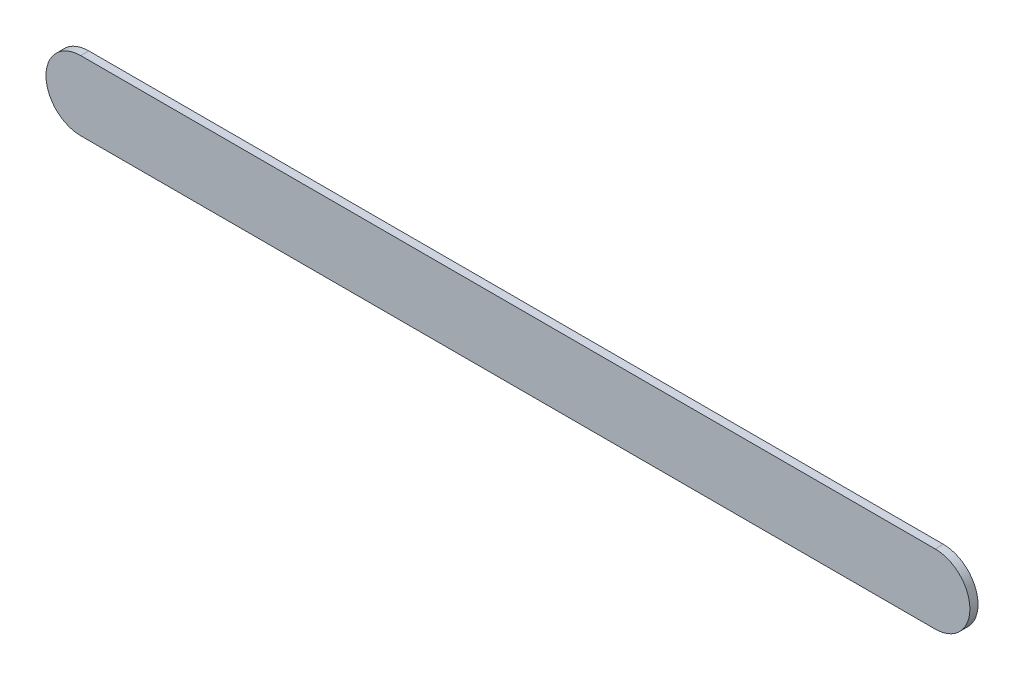
ISO-10303-21;
HEADER;
FILE_DESCRIPTION(('STEP AP214'),'2;1');
FILE_NAME('part.step','',(''),(''),'','','');
FILE_SCHEMA(('AUTOMOTIVE_DESIGN { 1 0 10303 214 1 1 1 1 }'));
ENDSEC;
DATA;
#1=APPLICATION_CONTEXT('core data for automotive mechanical design processes');
#2=APPLICATION_PROTOCOL_DEFINITION('international standard','automotive_design',2000,#1);
#3=PRODUCT_CONTEXT('',#1,'mechanical');
#4=PRODUCT('Part','Part','',(#3));
#5=PRODUCT_RELATED_PRODUCT_CATEGORY('part','',(#4));
#6=PRODUCT_DEFINITION_FORMATION('','',#4);
#7=PRODUCT_DEFINITION_CONTEXT('part definition',#1,'design');
#8=PRODUCT_DEFINITION('design','',#6,#7);
#9=PRODUCT_DEFINITION_SHAPE('','',#8);
#10=(LENGTH_UNIT() NAMED_UNIT(*) SI_UNIT(.MILLI.,.METRE.));
#11=(NAMED_UNIT(*) PLANE_ANGLE_UNIT() SI_UNIT($,.RADIAN.));
#12=(NAMED_UNIT(*) SI_UNIT($,.STERADIAN.) SOLID_ANGLE_UNIT());
#13=UNCERTAINTY_MEASURE_WITH_UNIT(LENGTH_MEASURE(1.E-05),#10,'distance_accuracy_value','');
#14=(GEOMETRIC_REPRESENTATION_CONTEXT(3) GLOBAL_UNCERTAINTY_ASSIGNED_CONTEXT((#13)) GLOBAL_UNIT_ASSIGNED_CONTEXT((#10,
#11,#12)) REPRESENTATION_CONTEXT('',''));
#15=CARTESIAN_POINT('',(0.,0.,0.));
#16=DIRECTION('',(0.,0.,1.));
#17=DIRECTION('',(1.,0.,0.));
#18=AXIS2_PLACEMENT_3D('',#15,#16,#17);
#19=CARTESIAN_POINT('',(129.15,-46.32,1.635));
#20=DIRECTION('',(0.,0.,1.));
#21=DIRECTION('',(1.,0.,0.));
#22=AXIS2_PLACEMENT_3D('',#19,#20,#21);
#23=PLANE('',#22);
#24=DIRECTION('',(1.,0.,0.));
#25=VECTOR('',#24,1.);
#26=CARTESIAN_POINT('',(129.15,-46.32,1.635));
#27=LINE('',#26,#25);
#28=CARTESIAN_POINT('',(129.15,-46.32,1.635));
#29=VERTEX_POINT('',#28);
#30=CARTESIAN_POINT('',(132.84,-46.32,1.635));
#31=VERTEX_POINT('',#30);
#32=EDGE_CURVE('E93',#29,#31,#27,.T.);
#33=ORIENTED_EDGE('',*,*,#32,.T.);
#34=CARTESIAN_POINT('',(132.84,-46.17,1.635));
#35=DIRECTION('',(0.,0.,1.));
#36=DIRECTION('',(-1.894780628694E-13,-1.,0.));
#37=AXIS2_PLACEMENT_3D('',#34,#35,#36);
#38=CIRCLE('',#37,0.15);
#39=CARTESIAN_POINT('',(132.84,-46.02,1.635));
#40=VERTEX_POINT('',#39);
#41=EDGE_CURVE('E71',#31,#40,#38,.T.);
#42=ORIENTED_EDGE('',*,*,#41,.T.);
#43=DIRECTION('',(-1.,0.,0.));
#44=VECTOR('',#43,1.);
#45=CARTESIAN_POINT('',(132.84,-46.02,1.635));
#46=LINE('',#45,#44);
#47=CARTESIAN_POINT('',(129.15,-46.02,1.635));
#48=VERTEX_POINT('',#47);
#49=EDGE_CURVE('E76',#40,#48,#46,.T.);
#50=ORIENTED_EDGE('',*,*,#49,.T.);
#51=CARTESIAN_POINT('',(129.15,-46.17,1.635));
#52=DIRECTION('',(0.,0.,1.));
#53=DIRECTION('',(1.894780628694E-13,1.,0.));
#54=AXIS2_PLACEMENT_3D('',#51,#52,#53);
#55=CIRCLE('',#54,0.15);
#56=EDGE_CURVE('E11',#48,#29,#55,.T.);
#57=ORIENTED_EDGE('',*,*,#56,.T.);
#58=EDGE_LOOP('',(#33,#42,#50,#57));
#59=FACE_BOUND('',#58,.T.);
#60=ADVANCED_FACE('F17',(#59),#23,.T.);
#61=CARTESIAN_POINT('',(129.15,-46.32,1.6));
#62=DIRECTION('',(0.,0.,1.));
#63=DIRECTION('',(1.,0.,0.));
#64=AXIS2_PLACEMENT_3D('',#61,#62,#63);
#65=PLANE('',#64);
#66=CARTESIAN_POINT('',(129.15,-46.17,1.6));
#67=DIRECTION('',(0.,0.,1.));
#68=DIRECTION('',(1.894780628694E-13,1.,0.));
#69=AXIS2_PLACEMENT_3D('',#66,#67,#68);
#70=CIRCLE('',#69,0.15);
#71=CARTESIAN_POINT('',(129.15,-46.02,1.6));
#72=VERTEX_POINT('',#71);
#73=CARTESIAN_POINT('',(129.15,-46.32,1.6));
#74=VERTEX_POINT('',#73);
#75=EDGE_CURVE('E20',#72,#74,#70,.T.);
#76=ORIENTED_EDGE('',*,*,#75,.F.);
#77=DIRECTION('',(-1.,0.,0.));
#78=VECTOR('',#77,1.);
#79=CARTESIAN_POINT('',(132.84,-46.02,1.6));
#80=LINE('',#79,#78);
#81=CARTESIAN_POINT('',(132.84,-46.02,1.6));
#82=VERTEX_POINT('',#81);
#83=EDGE_CURVE('E60',#82,#72,#80,.T.);
#84=ORIENTED_EDGE('',*,*,#83,.F.);
#85=CARTESIAN_POINT('',(132.84,-46.17,1.6));
#86=DIRECTION('',(0.,0.,1.));
#87=DIRECTION('',(-1.894780628694E-13,-1.,0.));
#88=AXIS2_PLACEMENT_3D('',#85,#86,#87);
#89=CIRCLE('',#88,0.15);
#90=CARTESIAN_POINT('',(132.84,-46.32,1.6));
#91=VERTEX_POINT('',#90);
#92=EDGE_CURVE('E65',#91,#82,#89,.T.);
#93=ORIENTED_EDGE('',*,*,#92,.F.);
#94=DIRECTION('',(1.,0.,0.));
#95=VECTOR('',#94,1.);
#96=CARTESIAN_POINT('',(129.15,-46.32,1.6));
#97=LINE('',#96,#95);
#98=EDGE_CURVE('E116',#74,#91,#97,.T.);
#99=ORIENTED_EDGE('',*,*,#98,.F.);
#100=EDGE_LOOP('',(#76,#84,#93,#99));
#101=FACE_BOUND('',#100,.T.);
#102=ADVANCED_FACE('F62',(#101),#65,.F.);
#103=CARTESIAN_POINT('',(129.15,-46.17,1.6));
#104=DIRECTION('',(0.,0.,-1.));
#105=DIRECTION('',(1.894780628694E-13,1.,0.));
#106=AXIS2_PLACEMENT_3D('',#103,#104,#105);
#107=CYLINDRICAL_SURFACE('',#106,0.15);
#108=ORIENTED_EDGE('',*,*,#75,.T.);
#109=DIRECTION('',(0.,0.,1.));
#110=VECTOR('',#109,1.);
#111=CARTESIAN_POINT('',(129.15,-46.32,1.6));
#112=LINE('',#111,#110);
#113=EDGE_CURVE('E87',#74,#29,#112,.T.);
#114=ORIENTED_EDGE('',*,*,#113,.T.);
#115=ORIENTED_EDGE('',*,*,#56,.F.);
#116=DIRECTION('',(0.,0.,1.));
#117=VECTOR('',#116,1.);
#118=CARTESIAN_POINT('',(129.15,-46.02,1.6));
#119=LINE('',#118,#117);
#120=EDGE_CURVE('E70',#72,#48,#119,.T.);
#121=ORIENTED_EDGE('',*,*,#120,.F.);
#122=EDGE_LOOP('',(#108,#114,#115,#121));
#123=FACE_BOUND('',#122,.T.);
#124=ADVANCED_FACE('F110',(#123),#107,.T.);
#125=CARTESIAN_POINT('',(132.84,-46.02,1.6));
#126=DIRECTION('',(0.,-1.,0.));
#127=DIRECTION('',(0.,0.,-1.));
#128=AXIS2_PLACEMENT_3D('',#125,#126,#127);
#129=PLANE('',#128);
#130=ORIENTED_EDGE('',*,*,#83,.T.);
#131=ORIENTED_EDGE('',*,*,#120,.T.);
#132=ORIENTED_EDGE('',*,*,#49,.F.);
#133=DIRECTION('',(0.,0.,1.));
#134=VECTOR('',#133,1.);
#135=CARTESIAN_POINT('',(132.84,-46.02,1.6));
#136=LINE('',#135,#134);
#137=EDGE_CURVE('E74',#82,#40,#136,.T.);
#138=ORIENTED_EDGE('',*,*,#137,.F.);
#139=EDGE_LOOP('',(#130,#131,#132,#138));
#140=FACE_BOUND('',#139,.T.);
#141=ADVANCED_FACE('F75',(#140),#129,.F.);
#142=CARTESIAN_POINT('',(132.84,-46.17,1.6));
#143=DIRECTION('',(0.,0.,-1.));
#144=DIRECTION('',(-1.894780628694E-13,-1.,0.));
#145=AXIS2_PLACEMENT_3D('',#142,#143,#144);
#146=CYLINDRICAL_SURFACE('',#145,0.15);
#147=ORIENTED_EDGE('',*,*,#92,.T.);
#148=ORIENTED_EDGE('',*,*,#137,.T.);
#149=ORIENTED_EDGE('',*,*,#41,.F.);
#150=DIRECTION('',(0.,0.,1.));
#151=VECTOR('',#150,1.);
#152=CARTESIAN_POINT('',(132.84,-46.32,1.6));
#153=LINE('',#152,#151);
#154=EDGE_CURVE('E84',#91,#31,#153,.T.);
#155=ORIENTED_EDGE('',*,*,#154,.F.);
#156=EDGE_LOOP('',(#147,#148,#149,#155));
#157=FACE_BOUND('',#156,.T.);
#158=ADVANCED_FACE('F82',(#157),#146,.T.);
#159=CARTESIAN_POINT('',(129.15,-46.32,1.6));
#160=DIRECTION('',(0.,1.,0.));
#161=DIRECTION('',(1.,0.,0.));
#162=AXIS2_PLACEMENT_3D('',#159,#160,#161);
#163=PLANE('',#162);
#164=ORIENTED_EDGE('',*,*,#98,.T.);
#165=ORIENTED_EDGE('',*,*,#154,.T.);
#166=ORIENTED_EDGE('',*,*,#32,.F.);
#167=ORIENTED_EDGE('',*,*,#113,.F.);
#168=EDGE_LOOP('',(#164,#165,#166,#167));
#169=FACE_BOUND('',#168,.T.);
#170=ADVANCED_FACE('F115',(#169),#163,.F.);
#171=CLOSED_SHELL('',(#60,#102,#124,#141,#158,#170));
#172=MANIFOLD_SOLID_BREP('B1',#171);
#173=ADVANCED_BREP_SHAPE_REPRESENTATION('',(#18,#172),#14);
#174=SHAPE_DEFINITION_REPRESENTATION(#9,#173);
ENDSEC;
END-ISO-10303-21;
